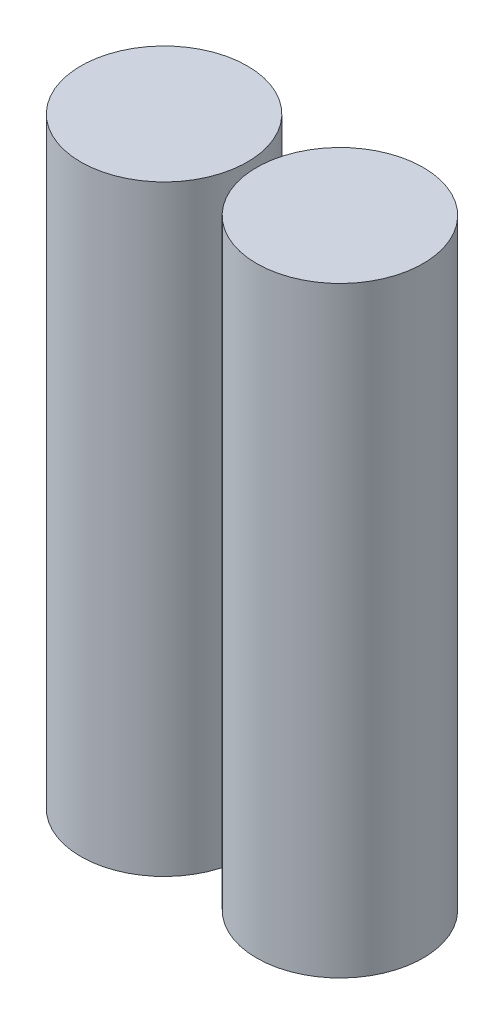
ISO-10303-21;
HEADER;
FILE_DESCRIPTION(('STEP AP214'),'2;1');
FILE_NAME('part.step','',(''),(''),'','','');
FILE_SCHEMA(('AUTOMOTIVE_DESIGN { 1 0 10303 214 1 1 1 1 }'));
ENDSEC;
DATA;
#1=APPLICATION_CONTEXT('core data for automotive mechanical design processes');
#2=APPLICATION_PROTOCOL_DEFINITION('international standard','automotive_design',2000,#1);
#3=PRODUCT_CONTEXT('',#1,'mechanical');
#4=PRODUCT('Part','Part','',(#3));
#5=PRODUCT_RELATED_PRODUCT_CATEGORY('part','',(#4));
#6=PRODUCT_DEFINITION_FORMATION('','',#4);
#7=PRODUCT_DEFINITION_CONTEXT('part definition',#1,'design');
#8=PRODUCT_DEFINITION('design','',#6,#7);
#9=PRODUCT_DEFINITION_SHAPE('','',#8);
#10=(LENGTH_UNIT() NAMED_UNIT(*) SI_UNIT(.MILLI.,.METRE.));
#11=(NAMED_UNIT(*) PLANE_ANGLE_UNIT() SI_UNIT($,.RADIAN.));
#12=(NAMED_UNIT(*) SI_UNIT($,.STERADIAN.) SOLID_ANGLE_UNIT());
#13=UNCERTAINTY_MEASURE_WITH_UNIT(LENGTH_MEASURE(1.E-05),#10,'distance_accuracy_value','');
#14=(GEOMETRIC_REPRESENTATION_CONTEXT(3) GLOBAL_UNCERTAINTY_ASSIGNED_CONTEXT((#13)) GLOBAL_UNIT_ASSIGNED_CONTEXT((#10,
#11,#12)) REPRESENTATION_CONTEXT('',''));
#15=CARTESIAN_POINT('',(0.,0.,0.));
#16=DIRECTION('',(0.,0.,1.));
#17=DIRECTION('',(1.,0.,0.));
#18=AXIS2_PLACEMENT_3D('',#15,#16,#17);
#19=CARTESIAN_POINT('',(19.,65.,0.));
#20=DIRECTION('',(0.,-1.,0.));
#21=DIRECTION('',(0.,0.,-1.));
#22=AXIS2_PLACEMENT_3D('',#19,#20,#21);
#23=CYLINDRICAL_SURFACE('',#22,9.);
#24=CARTESIAN_POINT('',(19.,65.,0.));
#25=DIRECTION('',(0.,1.,0.));
#26=DIRECTION('',(0.,0.,1.));
#27=AXIS2_PLACEMENT_3D('',#24,#25,#26);
#28=CIRCLE('',#27,9.);
#29=CARTESIAN_POINT('',(19.,65.,9.));
#30=VERTEX_POINT('',#29);
#31=EDGE_CURVE('E11',#30,#30,#28,.T.);
#32=ORIENTED_EDGE('',*,*,#31,.F.);
#33=EDGE_LOOP('',(#32));
#34=FACE_BOUND('',#33,.T.);
#35=CARTESIAN_POINT('',(19.,0.,0.));
#36=DIRECTION('',(0.,1.,0.));
#37=DIRECTION('',(0.,0.,1.));
#38=AXIS2_PLACEMENT_3D('',#35,#36,#37);
#39=CIRCLE('',#38,9.);
#40=CARTESIAN_POINT('',(19.,0.,9.));
#41=VERTEX_POINT('',#40);
#42=EDGE_CURVE('E42',#41,#41,#39,.T.);
#43=ORIENTED_EDGE('',*,*,#42,.T.);
#44=EDGE_LOOP('',(#43));
#45=FACE_BOUND('',#44,.T.);
#46=ADVANCED_FACE('F39',(#34,#45),#23,.T.);
#47=CARTESIAN_POINT('',(0.,65.,0.));
#48=DIRECTION('',(0.,1.,0.));
#49=DIRECTION('',(0.,0.,1.));
#50=AXIS2_PLACEMENT_3D('',#47,#48,#49);
#51=PLANE('',#50);
#52=ORIENTED_EDGE('',*,*,#31,.T.);
#53=EDGE_LOOP('',(#52));
#54=FACE_BOUND('',#53,.T.);
#55=ADVANCED_FACE('F54',(#54),#51,.T.);
#56=CARTESIAN_POINT('',(0.,0.,0.));
#57=DIRECTION('',(0.,1.,0.));
#58=DIRECTION('',(0.,0.,1.));
#59=AXIS2_PLACEMENT_3D('',#56,#57,#58);
#60=PLANE('',#59);
#61=ORIENTED_EDGE('',*,*,#42,.F.);
#62=EDGE_LOOP('',(#61));
#63=FACE_BOUND('',#62,.T.);
#64=ADVANCED_FACE('F52',(#63),#60,.F.);
#65=CLOSED_SHELL('',(#46,#55,#64));
#66=MANIFOLD_SOLID_BREP('B2',#65);
#67=CARTESIAN_POINT('',(0.,65.,0.));
#68=DIRECTION('',(0.,-1.,0.));
#69=DIRECTION('',(0.,0.,-1.));
#70=AXIS2_PLACEMENT_3D('',#67,#68,#69);
#71=CYLINDRICAL_SURFACE('',#70,9.);
#72=CARTESIAN_POINT('',(0.,65.,0.));
#73=DIRECTION('',(0.,1.,0.));
#74=DIRECTION('',(0.,0.,1.));
#75=AXIS2_PLACEMENT_3D('',#72,#73,#74);
#76=CIRCLE('',#75,9.);
#77=CARTESIAN_POINT('',(0.,65.,9.));
#78=VERTEX_POINT('',#77);
#79=EDGE_CURVE('E38',#78,#78,#76,.T.);
#80=ORIENTED_EDGE('',*,*,#79,.F.);
#81=EDGE_LOOP('',(#80));
#82=FACE_BOUND('',#81,.T.);
#83=CARTESIAN_POINT('',(0.,0.,0.));
#84=DIRECTION('',(0.,1.,0.));
#85=DIRECTION('',(0.,0.,1.));
#86=AXIS2_PLACEMENT_3D('',#83,#84,#85);
#87=CIRCLE('',#86,9.);
#88=CARTESIAN_POINT('',(0.,0.,9.));
#89=VERTEX_POINT('',#88);
#90=EDGE_CURVE('E83',#89,#89,#87,.T.);
#91=ORIENTED_EDGE('',*,*,#90,.T.);
#92=EDGE_LOOP('',(#91));
#93=FACE_BOUND('',#92,.T.);
#94=ADVANCED_FACE('F80',(#82,#93),#71,.T.);
#95=CARTESIAN_POINT('',(0.,65.,0.));
#96=DIRECTION('',(0.,1.,0.));
#97=DIRECTION('',(0.,0.,1.));
#98=AXIS2_PLACEMENT_3D('',#95,#96,#97);
#99=PLANE('',#98);
#100=ORIENTED_EDGE('',*,*,#79,.T.);
#101=EDGE_LOOP('',(#100));
#102=FACE_BOUND('',#101,.T.);
#103=ADVANCED_FACE('F95',(#102),#99,.T.);
#104=CARTESIAN_POINT('',(0.,0.,0.));
#105=DIRECTION('',(0.,1.,0.));
#106=DIRECTION('',(0.,0.,1.));
#107=AXIS2_PLACEMENT_3D('',#104,#105,#106);
#108=PLANE('',#107);
#109=ORIENTED_EDGE('',*,*,#90,.F.);
#110=EDGE_LOOP('',(#109));
#111=FACE_BOUND('',#110,.T.);
#112=ADVANCED_FACE('F93',(#111),#108,.F.);
#113=CLOSED_SHELL('',(#94,#103,#112));
#114=MANIFOLD_SOLID_BREP('B6',#113);
#115=ADVANCED_BREP_SHAPE_REPRESENTATION('',(#18,#66,#114),#14);
#116=SHAPE_DEFINITION_REPRESENTATION(#9,#115);
ENDSEC;
END-ISO-10303-21;
